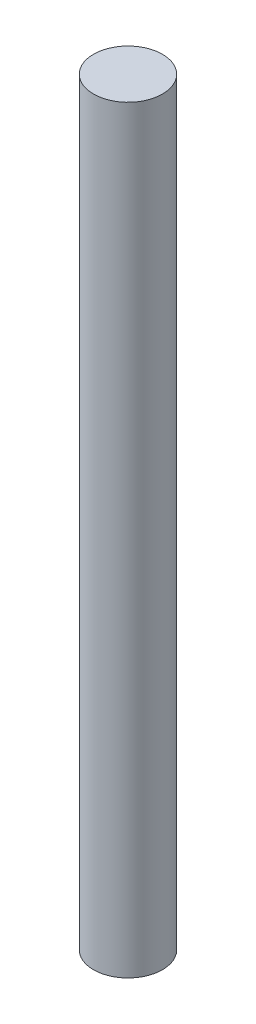
ISO-10303-21;
HEADER;
FILE_DESCRIPTION(('STEP AP214'),'2;1');
FILE_NAME('part.step','',(''),(''),'','','');
FILE_SCHEMA(('AUTOMOTIVE_DESIGN { 1 0 10303 214 1 1 1 1 }'));
ENDSEC;
DATA;
#1=APPLICATION_CONTEXT('core data for automotive mechanical design processes');
#2=APPLICATION_PROTOCOL_DEFINITION('international standard','automotive_design',2000,#1);
#3=PRODUCT_CONTEXT('',#1,'mechanical');
#4=PRODUCT('Part','Part','',(#3));
#5=PRODUCT_RELATED_PRODUCT_CATEGORY('part','',(#4));
#6=PRODUCT_DEFINITION_FORMATION('','',#4);
#7=PRODUCT_DEFINITION_CONTEXT('part definition',#1,'design');
#8=PRODUCT_DEFINITION('design','',#6,#7);
#9=PRODUCT_DEFINITION_SHAPE('','',#8);
#10=(LENGTH_UNIT() NAMED_UNIT(*) SI_UNIT(.MILLI.,.METRE.));
#11=(NAMED_UNIT(*) PLANE_ANGLE_UNIT() SI_UNIT($,.RADIAN.));
#12=(NAMED_UNIT(*) SI_UNIT($,.STERADIAN.) SOLID_ANGLE_UNIT());
#13=UNCERTAINTY_MEASURE_WITH_UNIT(LENGTH_MEASURE(1.E-05),#10,'distance_accuracy_value','');
#14=(GEOMETRIC_REPRESENTATION_CONTEXT(3) GLOBAL_UNCERTAINTY_ASSIGNED_CONTEXT((#13)) GLOBAL_UNIT_ASSIGNED_CONTEXT((#10,
#11,#12)) REPRESENTATION_CONTEXT('',''));
#15=CARTESIAN_POINT('',(0.,0.,0.));
#16=DIRECTION('',(0.,0.,1.));
#17=DIRECTION('',(1.,0.,0.));
#18=AXIS2_PLACEMENT_3D('',#15,#16,#17);
#19=CARTESIAN_POINT('',(0.,55.,0.));
#20=DIRECTION('',(0.,-1.,0.));
#21=DIRECTION('',(0.,0.,-1.));
#22=AXIS2_PLACEMENT_3D('',#19,#20,#21);
#23=CYLINDRICAL_SURFACE('',#22,2.5);
#24=CARTESIAN_POINT('',(0.,55.,0.));
#25=DIRECTION('',(0.,1.,0.));
#26=DIRECTION('',(0.,0.,1.));
#27=AXIS2_PLACEMENT_3D('',#24,#25,#26);
#28=CIRCLE('',#27,2.5);
#29=CARTESIAN_POINT('',(0.,55.,2.5));
#30=VERTEX_POINT('',#29);
#31=EDGE_CURVE('E10',#30,#30,#28,.T.);
#32=ORIENTED_EDGE('',*,*,#31,.F.);
#33=EDGE_LOOP('',(#32));
#34=FACE_BOUND('',#33,.T.);
#35=CARTESIAN_POINT('',(0.,0.,0.));
#36=DIRECTION('',(0.,1.,0.));
#37=DIRECTION('',(0.,0.,1.));
#38=AXIS2_PLACEMENT_3D('',#35,#36,#37);
#39=CIRCLE('',#38,2.5);
#40=CARTESIAN_POINT('',(0.,0.,2.5));
#41=VERTEX_POINT('',#40);
#42=EDGE_CURVE('E43',#41,#41,#39,.T.);
#43=ORIENTED_EDGE('',*,*,#42,.T.);
#44=EDGE_LOOP('',(#43));
#45=FACE_BOUND('',#44,.T.);
#46=ADVANCED_FACE('F40',(#34,#45),#23,.T.);
#47=CARTESIAN_POINT('',(0.,55.,0.));
#48=DIRECTION('',(0.,1.,0.));
#49=DIRECTION('',(0.,0.,1.));
#50=AXIS2_PLACEMENT_3D('',#47,#48,#49);
#51=PLANE('',#50);
#52=ORIENTED_EDGE('',*,*,#31,.T.);
#53=EDGE_LOOP('',(#52));
#54=FACE_BOUND('',#53,.T.);
#55=ADVANCED_FACE('F57',(#54),#51,.T.);
#56=CARTESIAN_POINT('',(0.,0.,0.));
#57=DIRECTION('',(0.,1.,0.));
#58=DIRECTION('',(0.,0.,1.));
#59=AXIS2_PLACEMENT_3D('',#56,#57,#58);
#60=PLANE('',#59);
#61=ORIENTED_EDGE('',*,*,#42,.F.);
#62=EDGE_LOOP('',(#61));
#63=FACE_BOUND('',#62,.T.);
#64=ADVANCED_FACE('F55',(#63),#60,.F.);
#65=CLOSED_SHELL('',(#46,#55,#64));
#66=MANIFOLD_SOLID_BREP('B2',#65);
#67=ADVANCED_BREP_SHAPE_REPRESENTATION('',(#18,#66),#14);
#68=SHAPE_DEFINITION_REPRESENTATION(#9,#67);
ENDSEC;
END-ISO-10303-21;
